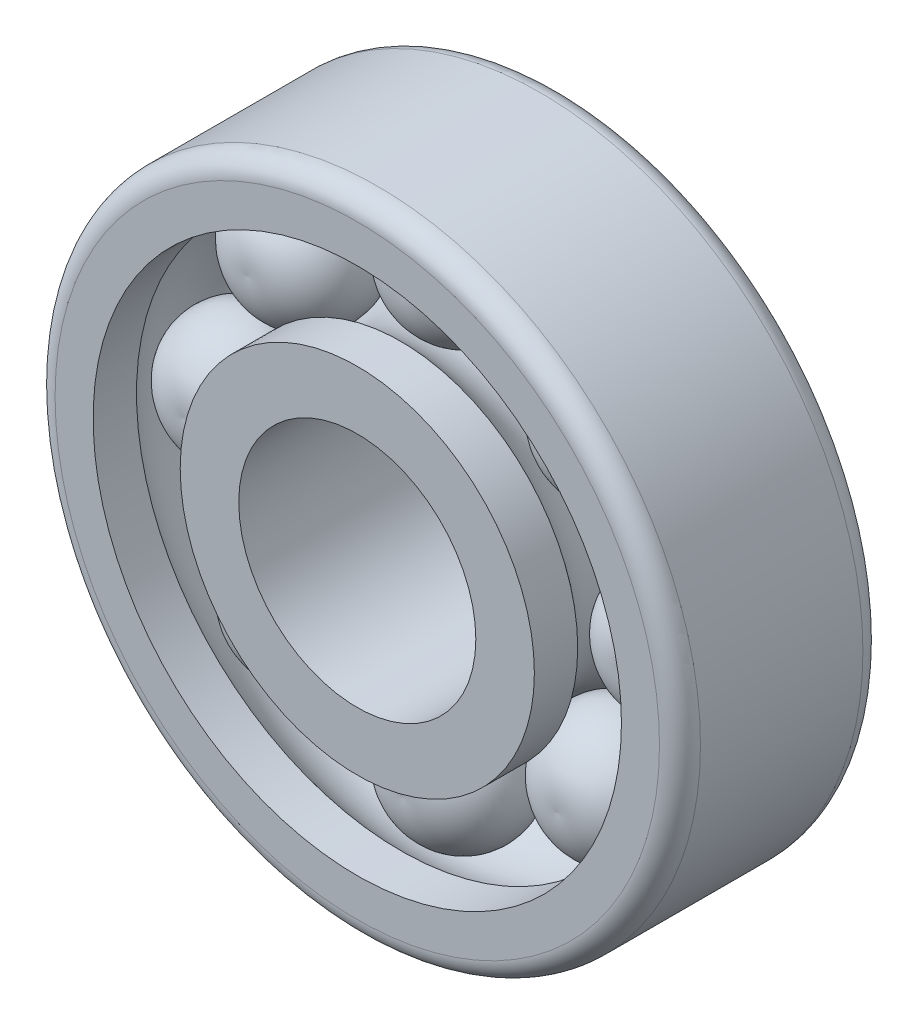
ISO-10303-21;
HEADER;
FILE_DESCRIPTION(('STEP AP214'),'2;1');
FILE_NAME('part.step','',(''),(''),'','','');
FILE_SCHEMA(('AUTOMOTIVE_DESIGN { 1 0 10303 214 1 1 1 1 }'));
ENDSEC;
DATA;
#1=APPLICATION_CONTEXT('core data for automotive mechanical design processes');
#2=APPLICATION_PROTOCOL_DEFINITION('international standard','automotive_design',2000,#1);
#3=PRODUCT_CONTEXT('',#1,'mechanical');
#4=PRODUCT('Part','Part','',(#3));
#5=PRODUCT_RELATED_PRODUCT_CATEGORY('part','',(#4));
#6=PRODUCT_DEFINITION_FORMATION('','',#4);
#7=PRODUCT_DEFINITION_CONTEXT('part definition',#1,'design');
#8=PRODUCT_DEFINITION('design','',#6,#7);
#9=PRODUCT_DEFINITION_SHAPE('','',#8);
#10=(LENGTH_UNIT() NAMED_UNIT(*) SI_UNIT(.MILLI.,.METRE.));
#11=(NAMED_UNIT(*) PLANE_ANGLE_UNIT() SI_UNIT($,.RADIAN.));
#12=(NAMED_UNIT(*) SI_UNIT($,.STERADIAN.) SOLID_ANGLE_UNIT());
#13=UNCERTAINTY_MEASURE_WITH_UNIT(LENGTH_MEASURE(1.E-05),#10,'distance_accuracy_value','');
#14=(GEOMETRIC_REPRESENTATION_CONTEXT(3) GLOBAL_UNCERTAINTY_ASSIGNED_CONTEXT((#13)) GLOBAL_UNIT_ASSIGNED_CONTEXT((#10,
#11,#12)) REPRESENTATION_CONTEXT('',''));
#15=CARTESIAN_POINT('',(0.,0.,0.));
#16=DIRECTION('',(0.,0.,1.));
#17=DIRECTION('',(1.,0.,0.));
#18=AXIS2_PLACEMENT_3D('',#15,#16,#17);
#19=CARTESIAN_POINT('',(-5.47161898600651,-5.47161898600637,-0.0387848840267928));
#20=DIRECTION('',(0.707106781186539,-0.707106781186556,0.));
#21=DIRECTION('',(-0.707106781186556,-0.707106781186539,0.));
#22=AXIS2_PLACEMENT_3D('',#19,#20,#21);
#23=CIRCLE('',#22,1.99190751322681);
#24=TRIMMED_CURVE('',#23,(PARAMETER_VALUE(-1.69690816234131)),
(PARAMETER_VALUE(1.69690816234131)),.T.,.PARAMETER.);
#25=CARTESIAN_POINT('',(-5.29446202413434,-5.29446202413421,-0.0387848840267928));
#26=DIRECTION('',(0.,0.,-1.));
#27=AXIS1_PLACEMENT('',#25,#26);
#28=SURFACE_OF_REVOLUTION('',#24,#27);
#29=CARTESIAN_POINT('',(-5.29446202413434,-5.29446202413421,-2.01487353663575));
#30=VERTEX_POINT('',#29);
#31=VERTEX_LOOP('',#30);
#32=FACE_BOUND('',#31,.T.);
#33=CARTESIAN_POINT('',(-5.29446202413434,-5.29446202413421,1.93730376858216));
#34=VERTEX_POINT('',#33);
#35=VERTEX_LOOP('',#34);
#36=FACE_BOUND('',#35,.T.);
#37=ADVANCED_FACE('F48',(#32,#36),#28,.T.);
#38=CLOSED_SHELL('',(#37));
#39=MANIFOLD_SOLID_BREP('B2',#38);
#40=CARTESIAN_POINT('',(0.,-7.73803777814843,-0.0387848840267928));
#41=DIRECTION('',(1.,0.,0.));
#42=DIRECTION('',(0.,-1.,0.));
#43=AXIS2_PLACEMENT_3D('',#40,#41,#42);
#44=CIRCLE('',#43,1.99190751322681);
#45=TRIMMED_CURVE('',#44,(PARAMETER_VALUE(-1.69690816234131)),
(PARAMETER_VALUE(1.69690816234131)),.T.,.PARAMETER.);
#46=CARTESIAN_POINT('',(0.,-7.4875,-0.0387848840267928));
#47=DIRECTION('',(0.,0.,-1.));
#48=AXIS1_PLACEMENT('',#46,#47);
#49=SURFACE_OF_REVOLUTION('',#45,#48);
#50=CARTESIAN_POINT('',(0.,-7.4875,-2.01487353663575));
#51=VERTEX_POINT('',#50);
#52=VERTEX_LOOP('',#51);
#53=FACE_BOUND('',#52,.T.);
#54=CARTESIAN_POINT('',(0.,-7.4875,1.93730376858216));
#55=VERTEX_POINT('',#54);
#56=VERTEX_LOOP('',#55);
#57=FACE_BOUND('',#56,.T.);
#58=ADVANCED_FACE('F75',(#53,#57),#49,.T.);
#59=CLOSED_SHELL('',(#58));
#60=MANIFOLD_SOLID_BREP('B6',#59);
#61=CARTESIAN_POINT('',(5.47161898600639,-5.47161898600649,-0.0387848840267928));
#62=DIRECTION('',(0.707106781186554,0.707106781186541,0.));
#63=DIRECTION('',(0.707106781186541,-0.707106781186554,0.));
#64=AXIS2_PLACEMENT_3D('',#61,#62,#63);
#65=CIRCLE('',#64,1.99190751322681);
#66=TRIMMED_CURVE('',#65,(PARAMETER_VALUE(-1.69690816234131)),
(PARAMETER_VALUE(1.69690816234131)),.T.,.PARAMETER.);
#67=CARTESIAN_POINT('',(5.29446202413423,-5.29446202413432,-0.0387848840267928));
#68=DIRECTION('',(0.,0.,-1.));
#69=AXIS1_PLACEMENT('',#67,#68);
#70=SURFACE_OF_REVOLUTION('',#66,#69);
#71=CARTESIAN_POINT('',(5.29446202413423,-5.29446202413432,-2.01487353663575));
#72=VERTEX_POINT('',#71);
#73=VERTEX_LOOP('',#72);
#74=FACE_BOUND('',#73,.T.);
#75=CARTESIAN_POINT('',(5.29446202413423,-5.29446202413432,1.93730376858216));
#76=VERTEX_POINT('',#75);
#77=VERTEX_LOOP('',#76);
#78=FACE_BOUND('',#77,.T.);
#79=ADVANCED_FACE('F102',(#74,#78),#70,.T.);
#80=CLOSED_SHELL('',(#79));
#81=MANIFOLD_SOLID_BREP('B42',#80);
#82=CARTESIAN_POINT('',(7.73803777814843,0.,-0.0387848840267928));
#83=DIRECTION('',(0.,1.,0.));
#84=DIRECTION('',(1.,0.,0.));
#85=AXIS2_PLACEMENT_3D('',#82,#83,#84);
#86=CIRCLE('',#85,1.99190751322681);
#87=TRIMMED_CURVE('',#86,(PARAMETER_VALUE(-1.69690816234131)),
(PARAMETER_VALUE(1.69690816234131)),.T.,.PARAMETER.);
#88=CARTESIAN_POINT('',(7.4875,0.,-0.0387848840267928));
#89=DIRECTION('',(0.,0.,-1.));
#90=AXIS1_PLACEMENT('',#88,#89);
#91=SURFACE_OF_REVOLUTION('',#87,#90);
#92=CARTESIAN_POINT('',(7.4875,0.,-2.01487353663575));
#93=VERTEX_POINT('',#92);
#94=VERTEX_LOOP('',#93);
#95=FACE_BOUND('',#94,.T.);
#96=CARTESIAN_POINT('',(7.4875,0.,1.93730376858216));
#97=VERTEX_POINT('',#96);
#98=VERTEX_LOOP('',#97);
#99=FACE_BOUND('',#98,.T.);
#100=ADVANCED_FACE('F129',(#95,#99),#91,.T.);
#101=CLOSED_SHELL('',(#100));
#102=MANIFOLD_SOLID_BREP('B69',#101);
#103=CARTESIAN_POINT('',(5.47161898600647,5.47161898600641,-0.0387848840267928));
#104=DIRECTION('',(-0.707106781186544,0.707106781186551,0.));
#105=DIRECTION('',(0.707106781186551,0.707106781186544,0.));
#106=AXIS2_PLACEMENT_3D('',#103,#104,#105);
#107=CIRCLE('',#106,1.99190751322681);
#108=TRIMMED_CURVE('',#107,(PARAMETER_VALUE(-1.69690816234131)),
(PARAMETER_VALUE(1.69690816234131)),.T.,.PARAMETER.);
#109=CARTESIAN_POINT('',(5.2944620241343,5.29446202413425,-0.0387848840267928));
#110=DIRECTION('',(0.,0.,-1.));
#111=AXIS1_PLACEMENT('',#109,#110);
#112=SURFACE_OF_REVOLUTION('',#108,#111);
#113=CARTESIAN_POINT('',(5.2944620241343,5.29446202413425,-2.01487353663575));
#114=VERTEX_POINT('',#113);
#115=VERTEX_LOOP('',#114);
#116=FACE_BOUND('',#115,.T.);
#117=CARTESIAN_POINT('',(5.2944620241343,5.29446202413425,1.93730376858216));
#118=VERTEX_POINT('',#117);
#119=VERTEX_LOOP('',#118);
#120=FACE_BOUND('',#119,.T.);
#121=ADVANCED_FACE('F156',(#116,#120),#112,.T.);
#122=CLOSED_SHELL('',(#121));
#123=MANIFOLD_SOLID_BREP('B96',#122);
#124=CARTESIAN_POINT('',(0.,7.73803777814843,-0.0387848840267928));
#125=DIRECTION('',(-1.,0.,0.));
#126=DIRECTION('',(0.,1.,0.));
#127=AXIS2_PLACEMENT_3D('',#124,#125,#126);
#128=CIRCLE('',#127,1.99190751322681);
#129=TRIMMED_CURVE('',#128,(PARAMETER_VALUE(-1.69690816234131)),
(PARAMETER_VALUE(1.69690816234131)),.T.,.PARAMETER.);
#130=CARTESIAN_POINT('',(0.,7.4875,-0.0387848840267928));
#131=DIRECTION('',(0.,0.,-1.));
#132=AXIS1_PLACEMENT('',#130,#131);
#133=SURFACE_OF_REVOLUTION('',#129,#132);
#134=CARTESIAN_POINT('',(0.,7.4875,-2.01487353663575));
#135=VERTEX_POINT('',#134);
#136=VERTEX_LOOP('',#135);
#137=FACE_BOUND('',#136,.T.);
#138=CARTESIAN_POINT('',(0.,7.4875,1.93730376858216));
#139=VERTEX_POINT('',#138);
#140=VERTEX_LOOP('',#139);
#141=FACE_BOUND('',#140,.T.);
#142=ADVANCED_FACE('F183',(#137,#141),#133,.T.);
#143=CLOSED_SHELL('',(#142));
#144=MANIFOLD_SOLID_BREP('B123',#143);
#145=CARTESIAN_POINT('',(-5.47161898600643,5.47161898600645,-0.0387848840267928));
#146=DIRECTION('',(-0.707106781186549,-0.707106781186546,0.));
#147=DIRECTION('',(-0.707106781186546,0.707106781186549,0.));
#148=AXIS2_PLACEMENT_3D('',#145,#146,#147);
#149=CIRCLE('',#148,1.99190751322681);
#150=TRIMMED_CURVE('',#149,(PARAMETER_VALUE(-1.69690816234131)),
(PARAMETER_VALUE(1.69690816234131)),.T.,.PARAMETER.);
#151=CARTESIAN_POINT('',(-5.29446202413427,5.29446202413429,-0.0387848840267928));
#152=DIRECTION('',(0.,0.,-1.));
#153=AXIS1_PLACEMENT('',#151,#152);
#154=SURFACE_OF_REVOLUTION('',#150,#153);
#155=CARTESIAN_POINT('',(-5.29446202413427,5.29446202413429,-2.01487353663575));
#156=VERTEX_POINT('',#155);
#157=VERTEX_LOOP('',#156);
#158=FACE_BOUND('',#157,.T.);
#159=CARTESIAN_POINT('',(-5.29446202413427,5.29446202413429,1.93730376858216));
#160=VERTEX_POINT('',#159);
#161=VERTEX_LOOP('',#160);
#162=FACE_BOUND('',#161,.T.);
#163=ADVANCED_FACE('F210',(#158,#162),#154,.T.);
#164=CLOSED_SHELL('',(#163));
#165=MANIFOLD_SOLID_BREP('B150',#164);
#166=CARTESIAN_POINT('',(0.,0.,0.));
#167=DIRECTION('',(0.,0.,1.));
#168=DIRECTION('',(1.,0.,0.));
#169=AXIS2_PLACEMENT_3D('',#166,#167,#168);
#170=CYLINDRICAL_SURFACE('',#169,4.05);
#171=CARTESIAN_POINT('',(0.,0.,-3.475));
#172=DIRECTION('',(0.,0.,1.));
#173=DIRECTION('',(1.,0.,0.));
#174=AXIS2_PLACEMENT_3D('',#171,#172,#173);
#175=CIRCLE('',#174,4.05);
#176=CARTESIAN_POINT('',(4.05,0.,-3.475));
#177=VERTEX_POINT('',#176);
#178=EDGE_CURVE('E209',#177,#177,#175,.T.);
#179=ORIENTED_EDGE('',*,*,#178,.F.);
#180=EDGE_LOOP('',(#179));
#181=FACE_BOUND('',#180,.T.);
#182=CARTESIAN_POINT('',(0.,0.,3.475));
#183=DIRECTION('',(0.,0.,1.));
#184=DIRECTION('',(1.,0.,0.));
#185=AXIS2_PLACEMENT_3D('',#182,#183,#184);
#186=CIRCLE('',#185,4.05);
#187=CARTESIAN_POINT('',(4.05,0.,3.475));
#188=VERTEX_POINT('',#187);
#189=EDGE_CURVE('E259',#188,#188,#186,.T.);
#190=ORIENTED_EDGE('',*,*,#189,.T.);
#191=EDGE_LOOP('',(#190));
#192=FACE_BOUND('',#191,.T.);
#193=ADVANCED_FACE('F237',(#181,#192),#170,.F.);
#194=CARTESIAN_POINT('',(-6.05,0.,-3.475));
#195=DIRECTION('',(0.,0.,1.));
#196=DIRECTION('',(1.,0.,0.));
#197=AXIS2_PLACEMENT_3D('',#194,#195,#196);
#198=PLANE('',#197);
#199=CARTESIAN_POINT('',(0.,0.,-3.475));
#200=DIRECTION('',(0.,0.,1.));
#201=DIRECTION('',(1.,0.,0.));
#202=AXIS2_PLACEMENT_3D('',#199,#200,#201);
#203=CIRCLE('',#202,6.05);
#204=CARTESIAN_POINT('',(6.05,0.,-3.475));
#205=VERTEX_POINT('',#204);
#206=EDGE_CURVE('E243',#205,#205,#203,.T.);
#207=ORIENTED_EDGE('',*,*,#206,.F.);
#208=EDGE_LOOP('',(#207));
#209=FACE_BOUND('',#208,.T.);
#210=ORIENTED_EDGE('',*,*,#178,.T.);
#211=EDGE_LOOP('',(#210));
#212=FACE_BOUND('',#211,.T.);
#213=ADVANCED_FACE('F284',(#209,#212),#198,.F.);
#214=CARTESIAN_POINT('',(0.,0.,0.));
#215=DIRECTION('',(0.,0.,1.));
#216=DIRECTION('',(1.,0.,0.));
#217=AXIS2_PLACEMENT_3D('',#214,#215,#216);
#218=CYLINDRICAL_SURFACE('',#217,6.05);
#219=CARTESIAN_POINT('',(0.,0.,-1.99374020373769));
#220=DIRECTION('',(0.,0.,1.));
#221=DIRECTION('',(1.,0.,0.));
#222=AXIS2_PLACEMENT_3D('',#219,#220,#221);
#223=CIRCLE('',#222,6.05);
#224=CARTESIAN_POINT('',(6.05,0.,-1.99374020373769));
#225=VERTEX_POINT('',#224);
#226=EDGE_CURVE('E247',#225,#225,#223,.T.);
#227=ORIENTED_EDGE('',*,*,#226,.F.);
#228=EDGE_LOOP('',(#227));
#229=FACE_BOUND('',#228,.T.);
#230=ORIENTED_EDGE('',*,*,#206,.T.);
#231=EDGE_LOOP('',(#230));
#232=FACE_BOUND('',#231,.T.);
#233=ADVANCED_FACE('F279',(#229,#232),#218,.T.);
#234=CARTESIAN_POINT('',(0.,0.,0.));
#235=DIRECTION('',(0.,0.,1.));
#236=DIRECTION('',(1.,0.,0.));
#237=AXIS2_PLACEMENT_3D('',#234,#235,#236);
#238=TOROIDAL_SURFACE('',#237,7.5375,2.4875);
#239=CARTESIAN_POINT('',(0.,0.,1.99374020373769));
#240=DIRECTION('',(0.,0.,1.));
#241=DIRECTION('',(1.,0.,0.));
#242=AXIS2_PLACEMENT_3D('',#239,#240,#241);
#243=CIRCLE('',#242,6.05);
#244=CARTESIAN_POINT('',(6.05,0.,1.99374020373769));
#245=VERTEX_POINT('',#244);
#246=EDGE_CURVE('E251',#245,#245,#243,.T.);
#247=ORIENTED_EDGE('',*,*,#246,.F.);
#248=EDGE_LOOP('',(#247));
#249=FACE_BOUND('',#248,.T.);
#250=ORIENTED_EDGE('',*,*,#226,.T.);
#251=EDGE_LOOP('',(#250));
#252=FACE_BOUND('',#251,.T.);
#253=ADVANCED_FACE('F273',(#249,#252),#238,.F.);
#254=CARTESIAN_POINT('',(0.,0.,0.));
#255=DIRECTION('',(0.,0.,1.));
#256=DIRECTION('',(1.,0.,0.));
#257=AXIS2_PLACEMENT_3D('',#254,#255,#256);
#258=CYLINDRICAL_SURFACE('',#257,6.05);
#259=CARTESIAN_POINT('',(0.,0.,3.475));
#260=DIRECTION('',(0.,0.,1.));
#261=DIRECTION('',(1.,0.,0.));
#262=AXIS2_PLACEMENT_3D('',#259,#260,#261);
#263=CIRCLE('',#262,6.05);
#264=CARTESIAN_POINT('',(6.05,0.,3.475));
#265=VERTEX_POINT('',#264);
#266=EDGE_CURVE('E256',#265,#265,#263,.T.);
#267=ORIENTED_EDGE('',*,*,#266,.F.);
#268=EDGE_LOOP('',(#267));
#269=FACE_BOUND('',#268,.T.);
#270=ORIENTED_EDGE('',*,*,#246,.T.);
#271=EDGE_LOOP('',(#270));
#272=FACE_BOUND('',#271,.T.);
#273=ADVANCED_FACE('F267',(#269,#272),#258,.T.);
#274=CARTESIAN_POINT('',(-6.05,0.,3.475));
#275=DIRECTION('',(0.,0.,-1.));
#276=DIRECTION('',(-1.,0.,0.));
#277=AXIS2_PLACEMENT_3D('',#274,#275,#276);
#278=PLANE('',#277);
#279=ORIENTED_EDGE('',*,*,#189,.F.);
#280=EDGE_LOOP('',(#279));
#281=FACE_BOUND('',#280,.T.);
#282=ORIENTED_EDGE('',*,*,#266,.T.);
#283=EDGE_LOOP('',(#282));
#284=FACE_BOUND('',#283,.T.);
#285=ADVANCED_FACE('F264',(#281,#284),#278,.F.);
#286=CLOSED_SHELL('',(#193,#213,#233,#253,#273,#285));
#287=MANIFOLD_SOLID_BREP('B177',#286);
#288=CARTESIAN_POINT('',(0.,0.,0.));
#289=DIRECTION('',(0.,0.,1.));
#290=DIRECTION('',(1.,0.,0.));
#291=AXIS2_PLACEMENT_3D('',#288,#289,#290);
#292=CYLINDRICAL_SURFACE('',#291,11.025);
#293=CARTESIAN_POINT('',(0.,0.,2.775));
#294=DIRECTION('',(0.,0.,-1.));
#295=DIRECTION('',(-1.,0.,0.));
#296=AXIS2_PLACEMENT_3D('',#293,#294,#295);
#297=CIRCLE('',#296,11.025);
#298=CARTESIAN_POINT('',(-11.025,0.,2.775));
#299=VERTEX_POINT('',#298);
#300=EDGE_CURVE('E344',#299,#299,#297,.T.);
#301=ORIENTED_EDGE('',*,*,#300,.T.);
#302=EDGE_LOOP('',(#301));
#303=FACE_BOUND('',#302,.T.);
#304=CARTESIAN_POINT('',(0.,0.,-2.775));
#305=DIRECTION('',(0.,0.,1.));
#306=DIRECTION('',(1.,0.,0.));
#307=AXIS2_PLACEMENT_3D('',#304,#305,#306);
#308=CIRCLE('',#307,11.025);
#309=CARTESIAN_POINT('',(11.025,0.,-2.775));
#310=VERTEX_POINT('',#309);
#311=EDGE_CURVE('E349',#310,#310,#308,.T.);
#312=ORIENTED_EDGE('',*,*,#311,.T.);
#313=EDGE_LOOP('',(#312));
#314=FACE_BOUND('',#313,.T.);
#315=ADVANCED_FACE('F336',(#303,#314),#292,.T.);
#316=CARTESIAN_POINT('',(-9.025,0.,3.475));
#317=DIRECTION('',(0.,0.,-1.));
#318=DIRECTION('',(-1.,0.,0.));
#319=AXIS2_PLACEMENT_3D('',#316,#317,#318);
#320=PLANE('',#319);
#321=CARTESIAN_POINT('',(0.,0.,3.475));
#322=DIRECTION('',(0.,0.,-1.));
#323=DIRECTION('',(-1.,0.,0.));
#324=AXIS2_PLACEMENT_3D('',#321,#322,#323);
#325=CIRCLE('',#324,10.325);
#326=CARTESIAN_POINT('',(-10.325,0.,3.475));
#327=VERTEX_POINT('',#326);
#328=EDGE_CURVE('E354',#327,#327,#325,.F.);
#329=ORIENTED_EDGE('',*,*,#328,.T.);
#330=EDGE_LOOP('',(#329));
#331=FACE_BOUND('',#330,.T.);
#332=CARTESIAN_POINT('',(0.,0.,3.475));
#333=DIRECTION('',(0.,0.,1.));
#334=DIRECTION('',(1.,0.,0.));
#335=AXIS2_PLACEMENT_3D('',#332,#333,#334);
#336=CIRCLE('',#335,9.025);
#337=CARTESIAN_POINT('',(9.025,0.,3.475));
#338=VERTEX_POINT('',#337);
#339=EDGE_CURVE('E360',#338,#338,#336,.T.);
#340=ORIENTED_EDGE('',*,*,#339,.F.);
#341=EDGE_LOOP('',(#340));
#342=FACE_BOUND('',#341,.T.);
#343=ADVANCED_FACE('F394',(#331,#342),#320,.F.);
#344=CARTESIAN_POINT('',(0.,0.,0.));
#345=DIRECTION('',(0.,0.,1.));
#346=DIRECTION('',(1.,0.,0.));
#347=AXIS2_PLACEMENT_3D('',#344,#345,#346);
#348=CYLINDRICAL_SURFACE('',#347,9.025);
#349=CARTESIAN_POINT('',(0.,0.,1.99374020373769));
#350=DIRECTION('',(0.,0.,1.));
#351=DIRECTION('',(1.,0.,0.));
#352=AXIS2_PLACEMENT_3D('',#349,#350,#351);
#353=CIRCLE('',#352,9.025);
#354=CARTESIAN_POINT('',(9.025,0.,1.99374020373769));
#355=VERTEX_POINT('',#354);
#356=EDGE_CURVE('E364',#355,#355,#353,.T.);
#357=ORIENTED_EDGE('',*,*,#356,.F.);
#358=EDGE_LOOP('',(#357));
#359=FACE_BOUND('',#358,.T.);
#360=ORIENTED_EDGE('',*,*,#339,.T.);
#361=EDGE_LOOP('',(#360));
#362=FACE_BOUND('',#361,.T.);
#363=ADVANCED_FACE('F388',(#359,#362),#348,.F.);
#364=CARTESIAN_POINT('',(0.,0.,0.));
#365=DIRECTION('',(0.,0.,1.));
#366=DIRECTION('',(1.,0.,0.));
#367=AXIS2_PLACEMENT_3D('',#364,#365,#366);
#368=TOROIDAL_SURFACE('',#367,7.5375,2.4875);
#369=CARTESIAN_POINT('',(0.,0.,-1.99374020373769));
#370=DIRECTION('',(0.,0.,1.));
#371=DIRECTION('',(1.,0.,0.));
#372=AXIS2_PLACEMENT_3D('',#369,#370,#371);
#373=CIRCLE('',#372,9.025);
#374=CARTESIAN_POINT('',(9.025,0.,-1.99374020373769));
#375=VERTEX_POINT('',#374);
#376=EDGE_CURVE('E368',#375,#375,#373,.T.);
#377=ORIENTED_EDGE('',*,*,#376,.F.);
#378=EDGE_LOOP('',(#377));
#379=FACE_BOUND('',#378,.T.);
#380=ORIENTED_EDGE('',*,*,#356,.T.);
#381=EDGE_LOOP('',(#380));
#382=FACE_BOUND('',#381,.T.);
#383=ADVANCED_FACE('F382',(#379,#382),#368,.F.);
#384=CARTESIAN_POINT('',(0.,0.,0.));
#385=DIRECTION('',(0.,0.,1.));
#386=DIRECTION('',(1.,0.,0.));
#387=AXIS2_PLACEMENT_3D('',#384,#385,#386);
#388=CYLINDRICAL_SURFACE('',#387,9.025);
#389=CARTESIAN_POINT('',(0.,0.,-3.475));
#390=DIRECTION('',(0.,0.,1.));
#391=DIRECTION('',(1.,0.,0.));
#392=AXIS2_PLACEMENT_3D('',#389,#390,#391);
#393=CIRCLE('',#392,9.025);
#394=CARTESIAN_POINT('',(9.025,0.,-3.475));
#395=VERTEX_POINT('',#394);
#396=EDGE_CURVE('E372',#395,#395,#393,.T.);
#397=ORIENTED_EDGE('',*,*,#396,.F.);
#398=EDGE_LOOP('',(#397));
#399=FACE_BOUND('',#398,.T.);
#400=ORIENTED_EDGE('',*,*,#376,.T.);
#401=EDGE_LOOP('',(#400));
#402=FACE_BOUND('',#401,.T.);
#403=ADVANCED_FACE('F379',(#399,#402),#388,.F.);
#404=CARTESIAN_POINT('',(-9.025,0.,-3.475));
#405=DIRECTION('',(0.,0.,1.));
#406=DIRECTION('',(1.,0.,0.));
#407=AXIS2_PLACEMENT_3D('',#404,#405,#406);
#408=PLANE('',#407);
#409=CARTESIAN_POINT('',(0.,0.,-3.475));
#410=DIRECTION('',(0.,0.,1.));
#411=DIRECTION('',(1.,0.,0.));
#412=AXIS2_PLACEMENT_3D('',#409,#410,#411);
#413=CIRCLE('',#412,10.325);
#414=CARTESIAN_POINT('',(10.325,0.,-3.475));
#415=VERTEX_POINT('',#414);
#416=EDGE_CURVE('E236',#415,#415,#413,.F.);
#417=ORIENTED_EDGE('',*,*,#416,.T.);
#418=EDGE_LOOP('',(#417));
#419=FACE_BOUND('',#418,.T.);
#420=ORIENTED_EDGE('',*,*,#396,.T.);
#421=EDGE_LOOP('',(#420));
#422=FACE_BOUND('',#421,.T.);
#423=ADVANCED_FACE('F377',(#419,#422),#408,.F.);
#424=CARTESIAN_POINT('',(0.,0.,2.775));
#425=DIRECTION('',(0.,0.,-1.));
#426=DIRECTION('',(-1.,0.,0.));
#427=AXIS2_PLACEMENT_3D('',#424,#425,#426);
#428=TOROIDAL_SURFACE('',#427,10.325,0.7);
#429=ORIENTED_EDGE('',*,*,#300,.F.);
#430=EDGE_LOOP('',(#429));
#431=FACE_BOUND('',#430,.T.);
#432=ORIENTED_EDGE('',*,*,#328,.F.);
#433=EDGE_LOOP('',(#432));
#434=FACE_BOUND('',#433,.T.);
#435=ADVANCED_FACE('F405',(#431,#434),#428,.T.);
#436=CARTESIAN_POINT('',(0.,0.,-2.775));
#437=DIRECTION('',(0.,0.,1.));
#438=DIRECTION('',(1.,0.,0.));
#439=AXIS2_PLACEMENT_3D('',#436,#437,#438);
#440=TOROIDAL_SURFACE('',#439,10.325,0.7);
#441=ORIENTED_EDGE('',*,*,#416,.F.);
#442=EDGE_LOOP('',(#441));
#443=FACE_BOUND('',#442,.T.);
#444=ORIENTED_EDGE('',*,*,#311,.F.);
#445=EDGE_LOOP('',(#444));
#446=FACE_BOUND('',#445,.T.);
#447=ADVANCED_FACE('F338',(#443,#446),#440,.T.);
#448=CLOSED_SHELL('',(#315,#343,#363,#383,#403,#423,#435,#447));
#449=MANIFOLD_SOLID_BREP('B204',#448);
#450=CARTESIAN_POINT('',(-7.73803777814843,0.,-0.0387848840267928));
#451=DIRECTION('',(0.,-1.,0.));
#452=DIRECTION('',(-1.,0.,0.));
#453=AXIS2_PLACEMENT_3D('',#450,#451,#452);
#454=CIRCLE('',#453,1.99190751322681);
#455=TRIMMED_CURVE('',#454,(PARAMETER_VALUE(-1.69690816234131)),
(PARAMETER_VALUE(1.69690816234131)),.T.,.PARAMETER.);
#456=CARTESIAN_POINT('',(-7.4875,0.,-0.0387848840267928));
#457=DIRECTION('',(0.,0.,-1.));
#458=AXIS1_PLACEMENT('',#456,#457);
#459=SURFACE_OF_REVOLUTION('',#455,#458);
#460=CARTESIAN_POINT('',(-7.4875,0.,-2.01487353663575));
#461=VERTEX_POINT('',#460);
#462=VERTEX_LOOP('',#461);
#463=FACE_BOUND('',#462,.T.);
#464=CARTESIAN_POINT('',(-7.4875,0.,1.93730376858216));
#465=VERTEX_POINT('',#464);
#466=VERTEX_LOOP('',#465);
#467=FACE_BOUND('',#466,.T.);
#468=ADVANCED_FACE('F466',(#463,#467),#459,.T.);
#469=CLOSED_SHELL('',(#468));
#470=MANIFOLD_SOLID_BREP('B231',#469);
#471=ADVANCED_BREP_SHAPE_REPRESENTATION('',(#18,#39,#60,#81,#102,#123,#144,#165,#287,#449,#470),#14);
#472=SHAPE_DEFINITION_REPRESENTATION(#9,#471);
ENDSEC;
END-ISO-10303-21;
